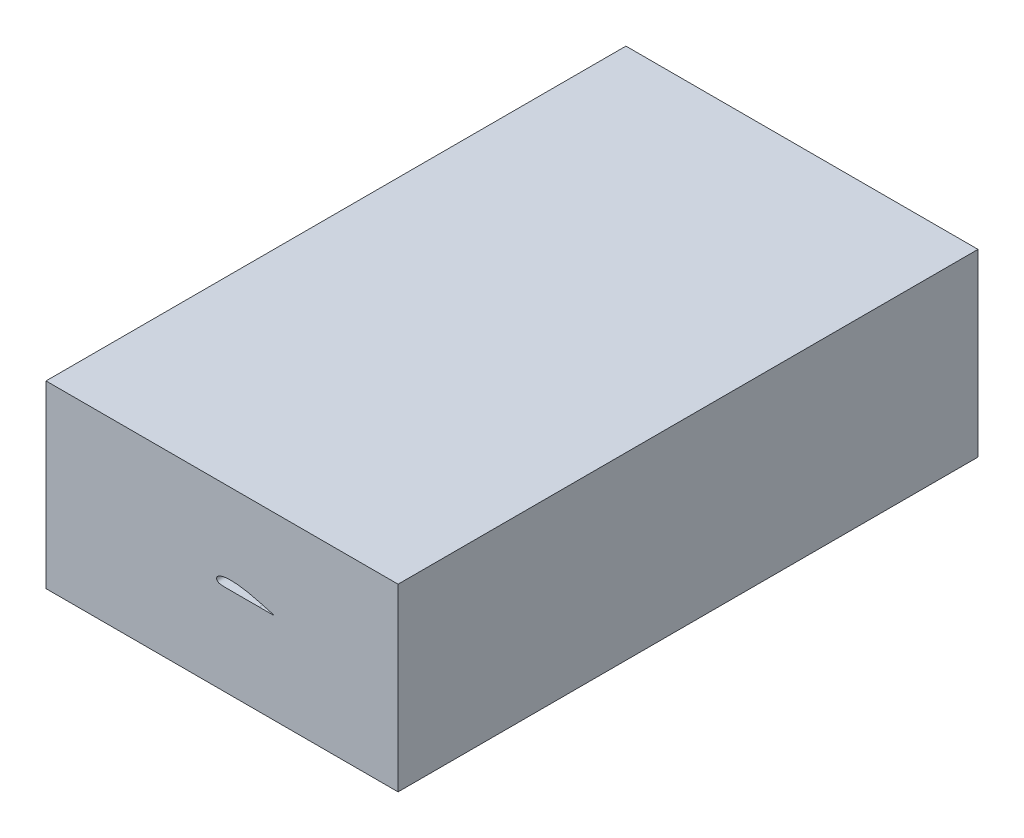
ISO-10303-21;
HEADER;
FILE_DESCRIPTION(('STEP AP214'),'2;1');
FILE_NAME('part.step','',(''),(''),'','','');
FILE_SCHEMA(('AUTOMOTIVE_DESIGN { 1 0 10303 214 1 1 1 1 }'));
ENDSEC;
DATA;
#1=APPLICATION_CONTEXT('core data for automotive mechanical design processes');
#2=APPLICATION_PROTOCOL_DEFINITION('international standard','automotive_design',2000,#1);
#3=PRODUCT_CONTEXT('',#1,'mechanical');
#4=PRODUCT('Part','Part','',(#3));
#5=PRODUCT_RELATED_PRODUCT_CATEGORY('part','',(#4));
#6=PRODUCT_DEFINITION_FORMATION('','',#4);
#7=PRODUCT_DEFINITION_CONTEXT('part definition',#1,'design');
#8=PRODUCT_DEFINITION('design','',#6,#7);
#9=PRODUCT_DEFINITION_SHAPE('','',#8);
#10=(LENGTH_UNIT() NAMED_UNIT(*) SI_UNIT(.MILLI.,.METRE.));
#11=(NAMED_UNIT(*) PLANE_ANGLE_UNIT() SI_UNIT($,.RADIAN.));
#12=(NAMED_UNIT(*) SI_UNIT($,.STERADIAN.) SOLID_ANGLE_UNIT());
#13=UNCERTAINTY_MEASURE_WITH_UNIT(LENGTH_MEASURE(1.E-05),#10,'distance_accuracy_value','');
#14=(GEOMETRIC_REPRESENTATION_CONTEXT(3) GLOBAL_UNCERTAINTY_ASSIGNED_CONTEXT((#13)) GLOBAL_UNIT_ASSIGNED_CONTEXT((#10,
#11,#12)) REPRESENTATION_CONTEXT('',''));
#15=CARTESIAN_POINT('',(0.,0.,0.));
#16=DIRECTION('',(0.,0.,1.));
#17=DIRECTION('',(1.,0.,0.));
#18=AXIS2_PLACEMENT_3D('',#15,#16,#17);
#19=CARTESIAN_POINT('',(0.,0.,1200.));
#20=DIRECTION('',(0.,0.,1.));
#21=DIRECTION('',(1.,0.,0.));
#22=AXIS2_PLACEMENT_3D('',#19,#20,#21);
#23=PLANE('',#22);
#24=DIRECTION('',(0.,-1.,0.));
#25=VECTOR('',#24,1.);
#26=CARTESIAN_POINT('',(0.,204.676260253226,1200.));
#27=LINE('',#26,#25);
#28=CARTESIAN_POINT('',(0.,204.676260253226,1200.));
#29=VERTEX_POINT('',#28);
#30=CARTESIAN_POINT('',(0.,-167.571352555479,1200.));
#31=VERTEX_POINT('',#30);
#32=EDGE_CURVE('E142',#29,#31,#27,.T.);
#33=ORIENTED_EDGE('',*,*,#32,.T.);
#34=DIRECTION('',(1.,0.,0.));
#35=VECTOR('',#34,1.);
#36=CARTESIAN_POINT('',(0.,-167.571352555479,1200.));
#37=LINE('',#36,#35);
#38=CARTESIAN_POINT('',(728.507712525835,-167.571352555479,1200.));
#39=VERTEX_POINT('',#38);
#40=EDGE_CURVE('E145',#31,#39,#37,.T.);
#41=ORIENTED_EDGE('',*,*,#40,.T.);
#42=DIRECTION('',(0.,1.,0.));
#43=VECTOR('',#42,1.);
#44=CARTESIAN_POINT('',(728.507712525835,204.676260253226,1200.));
#45=LINE('',#44,#43);
#46=CARTESIAN_POINT('',(728.507712525835,204.676260253226,1200.));
#47=VERTEX_POINT('',#46);
#48=EDGE_CURVE('E148',#39,#47,#45,.T.);
#49=ORIENTED_EDGE('',*,*,#48,.T.);
#50=DIRECTION('',(-1.,0.,0.));
#51=VECTOR('',#50,1.);
#52=CARTESIAN_POINT('',(0.,204.676260253226,1200.));
#53=LINE('',#52,#51);
#54=EDGE_CURVE('E150',#47,#29,#53,.T.);
#55=ORIENTED_EDGE('',*,*,#54,.T.);
#56=EDGE_LOOP('',(#33,#41,#49,#55));
#57=FACE_BOUND('',#56,.T.);
#58=DIRECTION('',(1.,0.,0.));
#59=VECTOR('',#58,1.);
#60=CARTESIAN_POINT('',(441.393772371793,20.1124523795362,1200.));
#61=LINE('',#60,#59);
#62=CARTESIAN_POINT('',(441.393772371793,20.1124523795362,1200.));
#63=VERTEX_POINT('',#62);
#64=CARTESIAN_POINT('',(470.720248748028,20.1124523795363,1200.));
#65=VERTEX_POINT('',#64);
#66=EDGE_CURVE('E106',#63,#65,#61,.T.);
#67=ORIENTED_EDGE('',*,*,#66,.F.);
#68=CARTESIAN_POINT('',(442.557049847993,28.8562779930486,1200.));
#69=CARTESIAN_POINT('',(439.072672672651,29.8120661893965,1200.));
#70=CARTESIAN_POINT('',(432.099912620264,31.6715962162049,1200.));
#71=CARTESIAN_POINT('',(421.486806005528,34.1105780280946,1200.));
#72=CARTESIAN_POINT('',(410.779849110611,36.1975398101461,1200.));
#73=CARTESIAN_POINT('',(401.720197274352,37.488657383955,1200.));
#74=CARTESIAN_POINT('',(394.41281853896,38.2045326701608,1200.));
#75=CARTESIAN_POINT('',(388.865337545691,38.5359098487311,1200.));
#76=CARTESIAN_POINT('',(383.377043684156,38.6453962158012,1200.));
#77=CARTESIAN_POINT('',(378.776739099679,38.6310045666827,1200.));
#78=CARTESIAN_POINT('',(374.963490259182,38.4319190984465,1200.));
#79=CARTESIAN_POINT('',(372.066182641251,38.140016341929,1200.));
#80=CARTESIAN_POINT('',(369.210683302152,37.7069672209041,1200.));
#81=CARTESIAN_POINT('',(366.827818433234,37.2314362615503,1200.));
#82=CARTESIAN_POINT('',(364.908429325882,36.7538958923076,1200.));
#83=CARTESIAN_POINT('',(363.479940401,36.3494856552582,1200.));
#84=CARTESIAN_POINT('',(362.056434922454,35.8957673309557,1200.));
#85=CARTESIAN_POINT('',(360.572839348893,35.35285722665,1200.));
#86=CARTESIAN_POINT('',(359.28769826388,34.7841452711708,1200.));
#87=CARTESIAN_POINT('',(358.216447641223,34.2146001399463,1200.));
#88=CARTESIAN_POINT('',(357.389050585476,33.7068980737799,1200.));
#89=CARTESIAN_POINT('',(356.552615658043,33.1030648747338,1200.));
#90=CARTESIAN_POINT('',(355.820762745851,32.4753357525396,1200.));
#91=CARTESIAN_POINT('',(355.354503462645,32.0442095034921,1200.));
#92=CARTESIAN_POINT('',(354.855699670665,31.5528495532229,1200.));
#93=CARTESIAN_POINT('',(354.389957132187,31.0255851572889,1200.));
#94=CARTESIAN_POINT('',(353.964999314076,30.4492034467225,1200.));
#95=CARTESIAN_POINT('',(353.586282932792,29.767186255399,1200.));
#96=CARTESIAN_POINT('',(353.227738954648,28.9329442974887,1200.));
#97=CARTESIAN_POINT('',(352.961298812208,27.6499416267636,1200.));
#98=CARTESIAN_POINT('',(353.111643283169,26.2983268889727,1200.));
#99=CARTESIAN_POINT('',(353.365330175192,25.4506232836227,1200.));
#100=CARTESIAN_POINT('',(353.695602528084,24.7528864611856,1200.));
#101=CARTESIAN_POINT('',(353.998210399166,24.262418144221,1200.));
#102=CARTESIAN_POINT('',(354.347839515911,23.7930228675255,1200.));
#103=CARTESIAN_POINT('',(354.788881725835,23.3017151067969,1200.));
#104=CARTESIAN_POINT('',(355.325142217004,22.8111128434673,1200.));
#105=CARTESIAN_POINT('',(356.055967315444,22.2868342790246,1200.));
#106=CARTESIAN_POINT('',(356.839748985731,21.8718358810368,1200.));
#107=CARTESIAN_POINT('',(357.765467063464,21.5068160558118,1200.));
#108=CARTESIAN_POINT('',(358.640116289018,21.2810109318307,1200.));
#109=CARTESIAN_POINT('',(359.28804598777,21.1302618440849,1200.));
#110=CARTESIAN_POINT('',(360.069783323769,20.9562480213636,1200.));
#111=CARTESIAN_POINT('',(360.904853145306,20.8055776986475,1200.));
#112=CARTESIAN_POINT('',(361.971898145868,20.6520119396105,1200.));
#113=CARTESIAN_POINT('',(363.214024727821,20.526416591067,1200.));
#114=CARTESIAN_POINT('',(364.578709921404,20.4100810965767,1200.));
#115=CARTESIAN_POINT('',(365.978183778209,20.3046202883556,1200.));
#116=CARTESIAN_POINT('',(367.378711377044,20.2199849675604,1200.));
#117=CARTESIAN_POINT('',(369.228950931682,20.131407075753,1200.));
#118=CARTESIAN_POINT('',(371.530679735066,20.0563600982902,1200.));
#119=CARTESIAN_POINT('',(374.271249485054,20.0109189711607,1200.));
#120=CARTESIAN_POINT('',(376.991001378152,19.9944477821466,1200.));
#121=CARTESIAN_POINT('',(379.696108674457,19.9963683471482,1200.));
#122=CARTESIAN_POINT('',(383.274859524469,20.0094440069358,1200.));
#123=CARTESIAN_POINT('',(387.73502139687,20.0176599108285,1200.));
#124=CARTESIAN_POINT('',(393.104461409822,20.0244259580925,1200.));
#125=CARTESIAN_POINT('',(398.470497743268,20.0350356377404,1200.));
#126=CARTESIAN_POINT('',(403.835453793735,20.0447632587505,1200.));
#127=CARTESIAN_POINT('',(410.989397891903,20.0580212802337,1200.));
#128=CARTESIAN_POINT('',(419.93147629828,20.0736388729501,1200.));
#129=CARTESIAN_POINT('',(430.662185951528,20.0932549024161,1200.));
#130=CARTESIAN_POINT('',(437.816630749247,20.1056430744243,1200.));
#131=CARTESIAN_POINT('',(441.393772371793,20.1124523795362,1200.));
#132=B_SPLINE_CURVE_WITH_KNOTS('',3,(#68,#69,#70,#71,#72,#73,#74,#75,#76,#77,#78,#79,#80,#81,
#82,#83,#84,#85,#86,#87,#88,#89,#90,#91,#92,#93,#94,#95,#96,#97,#98,#99,#100,#101,#102,#103,
#104,#105,#106,#107,#108,#109,#110,#111,#112,#113,#114,#115,#116,#117,#118,#119,#120,#121,#122,
#123,#124,#125,#126,#127,#128,#129,#130,#131),.UNSPECIFIED.,.F.,.F.,(4,1,1,1,1,1,1,1,1,1,1,1,1,
1,1,1,1,1,1,1,1,1,1,1,1,1,1,1,1,1,1,1,1,1,1,1,1,1,1,1,1,1,1,1,1,1,1,1,1,1,1,1,1,1,1,1,1,1,1,1,1,
4),(0.,0.0624984756248744,0.124996951249749,0.187495426874623,0.249993902499497,
0.281243140311935,0.312492378124372,0.343741615936809,0.374990853749246,0.390615472655465,
0.406240091561684,0.421864710467902,0.437489329374121,0.44530163882723,0.453113948280339,
0.460926257733449,0.468738567186558,0.476550876639667,0.480457031366222,0.484363186092776,
0.488269340819331,0.492175495545886,0.49608165027244,0.498034727635718,0.499987804998995,
0.501940882362272,0.502917421043911,0.50389395972555,0.505847037088827,0.506823575770466,
0.507800114452104,0.508776653133743,0.509753191815382,0.51072973049702,0.511706269178659,
0.513659346541936,0.515612423905214,0.517565501268491,0.519518578631768,0.523424733358323,
0.527330888084878,0.531237042811432,0.535143197537987,0.539049352264542,0.546861661717651,
0.55467397117076,0.562486280623869,0.570298590076979,0.578110899530088,0.593735518436307,
0.609360137342525,0.624984756248744,0.640609375154962,0.656233994061181,0.687483231873618,
0.718732469686055,0.749981707498493,0.78123094531093,0.812480183123367,0.874978658748241,
0.937477134373116,0.99997560999799),.UNSPECIFIED.);
#133=CARTESIAN_POINT('',(442.557049847993,28.8562779930486,1200.));
#134=VERTEX_POINT('',#133);
#135=EDGE_CURVE('E98',#134,#63,#132,.T.);
#136=ORIENTED_EDGE('',*,*,#135,.F.);
#137=DIRECTION('',(-0.964376117229069,0.264534883367364,0.));
#138=VECTOR('',#137,1.);
#139=CARTESIAN_POINT('',(470.852516189712,21.0946404381508,1200.));
#140=LINE('',#139,#138);
#141=CARTESIAN_POINT('',(470.852516189712,21.0946404381508,1200.));
#142=VERTEX_POINT('',#141);
#143=EDGE_CURVE('E120',#142,#134,#140,.T.);
#144=ORIENTED_EDGE('',*,*,#143,.F.);
#145=CARTESIAN_POINT('',(470.720248748028,20.6124523795363,1200.));
#146=DIRECTION('',(0.,0.,1.));
#147=DIRECTION('',(1.,0.,0.));
#148=AXIS2_PLACEMENT_3D('',#145,#146,#147);
#149=CIRCLE('',#148,0.500000000000002);
#150=EDGE_CURVE('E118',#65,#142,#149,.T.);
#151=ORIENTED_EDGE('',*,*,#150,.F.);
#152=EDGE_LOOP('',(#67,#136,#144,#151));
#153=FACE_BOUND('',#152,.T.);
#154=ADVANCED_FACE('F33',(#57,#153),#23,.T.);
#155=CARTESIAN_POINT('',(0.,0.,0.));
#156=DIRECTION('',(0.,0.,1.));
#157=DIRECTION('',(1.,0.,0.));
#158=AXIS2_PLACEMENT_3D('',#155,#156,#157);
#159=PLANE('',#158);
#160=DIRECTION('',(0.,-1.,0.));
#161=VECTOR('',#160,1.);
#162=CARTESIAN_POINT('',(0.,204.676260253226,0.));
#163=LINE('',#162,#161);
#164=CARTESIAN_POINT('',(0.,204.676260253226,0.));
#165=VERTEX_POINT('',#164);
#166=CARTESIAN_POINT('',(0.,-167.571352555479,0.));
#167=VERTEX_POINT('',#166);
#168=EDGE_CURVE('E114',#165,#167,#163,.T.);
#169=ORIENTED_EDGE('',*,*,#168,.F.);
#170=DIRECTION('',(-1.,0.,0.));
#171=VECTOR('',#170,1.);
#172=CARTESIAN_POINT('',(0.,204.676260253226,0.));
#173=LINE('',#172,#171);
#174=CARTESIAN_POINT('',(728.507712525835,204.676260253226,0.));
#175=VERTEX_POINT('',#174);
#176=EDGE_CURVE('E146',#175,#165,#173,.T.);
#177=ORIENTED_EDGE('',*,*,#176,.F.);
#178=DIRECTION('',(0.,1.,0.));
#179=VECTOR('',#178,1.);
#180=CARTESIAN_POINT('',(728.507712525835,204.676260253226,0.));
#181=LINE('',#180,#179);
#182=CARTESIAN_POINT('',(728.507712525835,-167.571352555479,0.));
#183=VERTEX_POINT('',#182);
#184=EDGE_CURVE('E157',#183,#175,#181,.T.);
#185=ORIENTED_EDGE('',*,*,#184,.F.);
#186=DIRECTION('',(1.,0.,0.));
#187=VECTOR('',#186,1.);
#188=CARTESIAN_POINT('',(0.,-167.571352555479,0.));
#189=LINE('',#188,#187);
#190=EDGE_CURVE('E155',#167,#183,#189,.T.);
#191=ORIENTED_EDGE('',*,*,#190,.F.);
#192=EDGE_LOOP('',(#169,#177,#185,#191));
#193=FACE_BOUND('',#192,.T.);
#194=CARTESIAN_POINT('',(442.557049847993,28.8562779930486,0.));
#195=CARTESIAN_POINT('',(439.072672672651,29.8120661893965,0.));
#196=CARTESIAN_POINT('',(432.099912620264,31.6715962162049,0.));
#197=CARTESIAN_POINT('',(421.486806005528,34.1105780280946,0.));
#198=CARTESIAN_POINT('',(410.779849110611,36.1975398101461,0.));
#199=CARTESIAN_POINT('',(401.720197274352,37.488657383955,0.));
#200=CARTESIAN_POINT('',(394.41281853896,38.2045326701608,0.));
#201=CARTESIAN_POINT('',(388.865337545691,38.5359098487311,0.));
#202=CARTESIAN_POINT('',(383.377043684156,38.6453962158012,0.));
#203=CARTESIAN_POINT('',(378.776739099679,38.6310045666827,0.));
#204=CARTESIAN_POINT('',(374.963490259182,38.4319190984465,0.));
#205=CARTESIAN_POINT('',(372.066182641251,38.140016341929,0.));
#206=CARTESIAN_POINT('',(369.210683302152,37.7069672209041,0.));
#207=CARTESIAN_POINT('',(366.827818433234,37.2314362615503,0.));
#208=CARTESIAN_POINT('',(364.908429325882,36.7538958923076,0.));
#209=CARTESIAN_POINT('',(363.479940401,36.3494856552582,0.));
#210=CARTESIAN_POINT('',(362.056434922454,35.8957673309557,0.));
#211=CARTESIAN_POINT('',(360.572839348893,35.35285722665,0.));
#212=CARTESIAN_POINT('',(359.28769826388,34.7841452711708,0.));
#213=CARTESIAN_POINT('',(358.216447641223,34.2146001399463,0.));
#214=CARTESIAN_POINT('',(357.389050585476,33.7068980737799,0.));
#215=CARTESIAN_POINT('',(356.552615658043,33.1030648747338,0.));
#216=CARTESIAN_POINT('',(355.820762745851,32.4753357525396,0.));
#217=CARTESIAN_POINT('',(355.354503462645,32.0442095034921,0.));
#218=CARTESIAN_POINT('',(354.855699670665,31.5528495532229,0.));
#219=CARTESIAN_POINT('',(354.389957132187,31.0255851572889,0.));
#220=CARTESIAN_POINT('',(353.964999314076,30.4492034467225,0.));
#221=CARTESIAN_POINT('',(353.586282932792,29.767186255399,0.));
#222=CARTESIAN_POINT('',(353.227738954648,28.9329442974887,0.));
#223=CARTESIAN_POINT('',(352.961298812208,27.6499416267636,0.));
#224=CARTESIAN_POINT('',(353.111643283169,26.2983268889727,0.));
#225=CARTESIAN_POINT('',(353.365330175192,25.4506232836227,0.));
#226=CARTESIAN_POINT('',(353.695602528084,24.7528864611856,0.));
#227=CARTESIAN_POINT('',(353.998210399166,24.262418144221,0.));
#228=CARTESIAN_POINT('',(354.347839515911,23.7930228675255,0.));
#229=CARTESIAN_POINT('',(354.788881725835,23.3017151067969,0.));
#230=CARTESIAN_POINT('',(355.325142217004,22.8111128434673,0.));
#231=CARTESIAN_POINT('',(356.055967315444,22.2868342790246,0.));
#232=CARTESIAN_POINT('',(356.839748985731,21.8718358810368,0.));
#233=CARTESIAN_POINT('',(357.765467063464,21.5068160558118,0.));
#234=CARTESIAN_POINT('',(358.640116289018,21.2810109318307,0.));
#235=CARTESIAN_POINT('',(359.28804598777,21.1302618440849,0.));
#236=CARTESIAN_POINT('',(360.069783323769,20.9562480213636,0.));
#237=CARTESIAN_POINT('',(360.904853145306,20.8055776986475,0.));
#238=CARTESIAN_POINT('',(361.971898145868,20.6520119396105,0.));
#239=CARTESIAN_POINT('',(363.214024727821,20.526416591067,0.));
#240=CARTESIAN_POINT('',(364.578709921404,20.4100810965767,0.));
#241=CARTESIAN_POINT('',(365.978183778209,20.3046202883556,0.));
#242=CARTESIAN_POINT('',(367.378711377044,20.2199849675604,0.));
#243=CARTESIAN_POINT('',(369.228950931682,20.131407075753,0.));
#244=CARTESIAN_POINT('',(371.530679735066,20.0563600982902,0.));
#245=CARTESIAN_POINT('',(374.271249485054,20.0109189711607,0.));
#246=CARTESIAN_POINT('',(376.991001378152,19.9944477821466,0.));
#247=CARTESIAN_POINT('',(379.696108674457,19.9963683471482,0.));
#248=CARTESIAN_POINT('',(383.274859524469,20.0094440069358,0.));
#249=CARTESIAN_POINT('',(387.73502139687,20.0176599108285,0.));
#250=CARTESIAN_POINT('',(393.104461409822,20.0244259580925,0.));
#251=CARTESIAN_POINT('',(398.470497743268,20.0350356377404,0.));
#252=CARTESIAN_POINT('',(403.835453793735,20.0447632587505,0.));
#253=CARTESIAN_POINT('',(410.989397891903,20.0580212802337,0.));
#254=CARTESIAN_POINT('',(419.93147629828,20.0736388729501,0.));
#255=CARTESIAN_POINT('',(430.662185951528,20.0932549024161,0.));
#256=CARTESIAN_POINT('',(437.816630749247,20.1056430744243,0.));
#257=CARTESIAN_POINT('',(441.393772371793,20.1124523795362,0.));
#258=B_SPLINE_CURVE_WITH_KNOTS('',3,(#194,#195,#196,#197,#198,#199,#200,#201,#202,#203,#204,
#205,#206,#207,#208,#209,#210,#211,#212,#213,#214,#215,#216,#217,#218,#219,#220,#221,#222,#223,
#224,#225,#226,#227,#228,#229,#230,#231,#232,#233,#234,#235,#236,#237,#238,#239,#240,#241,#242,
#243,#244,#245,#246,#247,#248,#249,#250,#251,#252,#253,#254,#255,#256,#257),.UNSPECIFIED.,.F.,
.F.,(4,1,1,1,1,1,1,1,1,1,1,1,1,1,1,1,1,1,1,1,1,1,1,1,1,1,1,1,1,1,1,1,1,1,1,1,1,1,1,1,1,1,1,1,1,
1,1,1,1,1,1,1,1,1,1,1,1,1,1,1,1,4),(0.,0.0624984756248744,0.124996951249749,0.187495426874623,
0.249993902499497,0.281243140311935,0.312492378124372,0.343741615936809,0.374990853749246,
0.390615472655465,0.406240091561684,0.421864710467902,0.437489329374121,0.44530163882723,
0.453113948280339,0.460926257733449,0.468738567186558,0.476550876639667,0.480457031366222,
0.484363186092776,0.488269340819331,0.492175495545886,0.49608165027244,0.498034727635718,
0.499987804998995,0.501940882362272,0.502917421043911,0.50389395972555,0.505847037088827,
0.506823575770466,0.507800114452104,0.508776653133743,0.509753191815382,0.51072973049702,
0.511706269178659,0.513659346541936,0.515612423905214,0.517565501268491,0.519518578631768,
0.523424733358323,0.527330888084878,0.531237042811432,0.535143197537987,0.539049352264542,
0.546861661717651,0.55467397117076,0.562486280623869,0.570298590076979,0.578110899530088,
0.593735518436307,0.609360137342525,0.624984756248744,0.640609375154962,0.656233994061181,
0.687483231873618,0.718732469686055,0.749981707498493,0.78123094531093,0.812480183123367,
0.874978658748241,0.937477134373116,0.99997560999799),.UNSPECIFIED.);
#259=CARTESIAN_POINT('',(442.557049847994,28.8562779930486,0.));
#260=VERTEX_POINT('',#259);
#261=CARTESIAN_POINT('',(441.393772371793,20.1124523795362,0.));
#262=VERTEX_POINT('',#261);
#263=EDGE_CURVE('E56',#260,#262,#258,.T.);
#264=ORIENTED_EDGE('',*,*,#263,.T.);
#265=DIRECTION('',(1.,0.,0.));
#266=VECTOR('',#265,1.);
#267=CARTESIAN_POINT('',(441.393772371793,20.1124523795362,0.));
#268=LINE('',#267,#266);
#269=CARTESIAN_POINT('',(470.720248748028,20.1124523795363,0.));
#270=VERTEX_POINT('',#269);
#271=EDGE_CURVE('E113',#262,#270,#268,.T.);
#272=ORIENTED_EDGE('',*,*,#271,.T.);
#273=CARTESIAN_POINT('',(470.720248748028,20.6124523795363,0.));
#274=DIRECTION('',(0.,0.,1.));
#275=DIRECTION('',(1.,0.,0.));
#276=AXIS2_PLACEMENT_3D('',#273,#274,#275);
#277=CIRCLE('',#276,0.500000000000002);
#278=CARTESIAN_POINT('',(470.852516189712,21.0946404381508,0.));
#279=VERTEX_POINT('',#278);
#280=EDGE_CURVE('E134',#270,#279,#277,.T.);
#281=ORIENTED_EDGE('',*,*,#280,.T.);
#282=DIRECTION('',(-0.964376117229069,0.264534883367364,0.));
#283=VECTOR('',#282,1.);
#284=CARTESIAN_POINT('',(470.852516189712,21.0946404381508,0.));
#285=LINE('',#284,#283);
#286=EDGE_CURVE('E107',#279,#260,#285,.T.);
#287=ORIENTED_EDGE('',*,*,#286,.T.);
#288=EDGE_LOOP('',(#264,#272,#281,#287));
#289=FACE_BOUND('',#288,.T.);
#290=ADVANCED_FACE('F175',(#193,#289),#159,.F.);
#291=CARTESIAN_POINT('',(0.,204.676260253226,1200.));
#292=DIRECTION('',(1.,0.,0.));
#293=DIRECTION('',(0.,0.,-1.));
#294=AXIS2_PLACEMENT_3D('',#291,#292,#293);
#295=PLANE('',#294);
#296=ORIENTED_EDGE('',*,*,#168,.T.);
#297=DIRECTION('',(0.,0.,-1.));
#298=VECTOR('',#297,1.);
#299=CARTESIAN_POINT('',(0.,-167.571352555479,1200.));
#300=LINE('',#299,#298);
#301=EDGE_CURVE('E11',#31,#167,#300,.T.);
#302=ORIENTED_EDGE('',*,*,#301,.F.);
#303=ORIENTED_EDGE('',*,*,#32,.F.);
#304=DIRECTION('',(0.,0.,-1.));
#305=VECTOR('',#304,1.);
#306=CARTESIAN_POINT('',(0.,204.676260253226,1200.));
#307=LINE('',#306,#305);
#308=EDGE_CURVE('E152',#29,#165,#307,.T.);
#309=ORIENTED_EDGE('',*,*,#308,.T.);
#310=EDGE_LOOP('',(#296,#302,#303,#309));
#311=FACE_BOUND('',#310,.T.);
#312=ADVANCED_FACE('F35',(#311),#295,.F.);
#313=CARTESIAN_POINT('',(0.,-167.571352555479,1200.));
#314=DIRECTION('',(0.,1.,0.));
#315=DIRECTION('',(0.,0.,1.));
#316=AXIS2_PLACEMENT_3D('',#313,#314,#315);
#317=PLANE('',#316);
#318=ORIENTED_EDGE('',*,*,#190,.T.);
#319=DIRECTION('',(0.,0.,-1.));
#320=VECTOR('',#319,1.);
#321=CARTESIAN_POINT('',(728.507712525835,-167.571352555479,1200.));
#322=LINE('',#321,#320);
#323=EDGE_CURVE('E41',#39,#183,#322,.T.);
#324=ORIENTED_EDGE('',*,*,#323,.F.);
#325=ORIENTED_EDGE('',*,*,#40,.F.);
#326=ORIENTED_EDGE('',*,*,#301,.T.);
#327=EDGE_LOOP('',(#318,#324,#325,#326));
#328=FACE_BOUND('',#327,.T.);
#329=ADVANCED_FACE('F185',(#328),#317,.F.);
#330=CARTESIAN_POINT('',(728.507712525835,204.676260253226,1200.));
#331=DIRECTION('',(-1.,0.,0.));
#332=DIRECTION('',(0.,0.,1.));
#333=AXIS2_PLACEMENT_3D('',#330,#331,#332);
#334=PLANE('',#333);
#335=ORIENTED_EDGE('',*,*,#184,.T.);
#336=DIRECTION('',(0.,0.,-1.));
#337=VECTOR('',#336,1.);
#338=CARTESIAN_POINT('',(728.507712525835,204.676260253226,1200.));
#339=LINE('',#338,#337);
#340=EDGE_CURVE('E162',#47,#175,#339,.T.);
#341=ORIENTED_EDGE('',*,*,#340,.F.);
#342=ORIENTED_EDGE('',*,*,#48,.F.);
#343=ORIENTED_EDGE('',*,*,#323,.T.);
#344=EDGE_LOOP('',(#335,#341,#342,#343));
#345=FACE_BOUND('',#344,.T.);
#346=ADVANCED_FACE('F169',(#345),#334,.F.);
#347=CARTESIAN_POINT('',(0.,204.676260253226,1200.));
#348=DIRECTION('',(0.,-1.,0.));
#349=DIRECTION('',(0.,0.,-1.));
#350=AXIS2_PLACEMENT_3D('',#347,#348,#349);
#351=PLANE('',#350);
#352=ORIENTED_EDGE('',*,*,#176,.T.);
#353=ORIENTED_EDGE('',*,*,#308,.F.);
#354=ORIENTED_EDGE('',*,*,#54,.F.);
#355=ORIENTED_EDGE('',*,*,#340,.T.);
#356=EDGE_LOOP('',(#352,#353,#354,#355));
#357=FACE_BOUND('',#356,.T.);
#358=ADVANCED_FACE('F179',(#357),#351,.F.);
#359=DIRECTION('',(0.,0.,-1.));
#360=VECTOR('',#359,1.);
#361=SURFACE_OF_LINEAR_EXTRUSION('',#132,#360);
#362=ORIENTED_EDGE('',*,*,#263,.F.);
#363=DIRECTION('',(0.,0.,-1.));
#364=VECTOR('',#363,1.);
#365=CARTESIAN_POINT('',(442.557049847993,28.8562779930486,1200.));
#366=LINE('',#365,#364);
#367=EDGE_CURVE('E102',#134,#260,#366,.T.);
#368=ORIENTED_EDGE('',*,*,#367,.F.);
#369=ORIENTED_EDGE('',*,*,#135,.T.);
#370=DIRECTION('',(0.,0.,-1.));
#371=VECTOR('',#370,1.);
#372=CARTESIAN_POINT('',(441.393772371793,20.1124523795362,1200.));
#373=LINE('',#372,#371);
#374=EDGE_CURVE('E101',#63,#262,#373,.T.);
#375=ORIENTED_EDGE('',*,*,#374,.T.);
#376=EDGE_LOOP('',(#362,#368,#369,#375));
#377=FACE_BOUND('',#376,.T.);
#378=ADVANCED_FACE('F100',(#377),#361,.T.);
#379=CARTESIAN_POINT('',(441.393772371793,20.1124523795362,1200.));
#380=DIRECTION('',(0.,1.,0.));
#381=DIRECTION('',(-1.,0.,0.));
#382=AXIS2_PLACEMENT_3D('',#379,#380,#381);
#383=PLANE('',#382);
#384=ORIENTED_EDGE('',*,*,#271,.F.);
#385=ORIENTED_EDGE('',*,*,#374,.F.);
#386=ORIENTED_EDGE('',*,*,#66,.T.);
#387=DIRECTION('',(0.,0.,-1.));
#388=VECTOR('',#387,1.);
#389=CARTESIAN_POINT('',(470.720248748028,20.1124523795363,1200.));
#390=LINE('',#389,#388);
#391=EDGE_CURVE('E115',#65,#270,#390,.T.);
#392=ORIENTED_EDGE('',*,*,#391,.T.);
#393=EDGE_LOOP('',(#384,#385,#386,#392));
#394=FACE_BOUND('',#393,.T.);
#395=ADVANCED_FACE('F110',(#394),#383,.T.);
#396=CARTESIAN_POINT('',(470.720248748028,20.6124523795363,1200.));
#397=DIRECTION('',(0.,0.,-1.));
#398=DIRECTION('',(-1.,0.,0.));
#399=AXIS2_PLACEMENT_3D('',#396,#397,#398);
#400=CYLINDRICAL_SURFACE('',#399,0.500000000000002);
#401=ORIENTED_EDGE('',*,*,#280,.F.);
#402=ORIENTED_EDGE('',*,*,#391,.F.);
#403=ORIENTED_EDGE('',*,*,#150,.T.);
#404=DIRECTION('',(0.,0.,-1.));
#405=VECTOR('',#404,1.);
#406=CARTESIAN_POINT('',(470.852516189712,21.0946404381508,1200.));
#407=LINE('',#406,#405);
#408=EDGE_CURVE('E48',#142,#279,#407,.T.);
#409=ORIENTED_EDGE('',*,*,#408,.T.);
#410=EDGE_LOOP('',(#401,#402,#403,#409));
#411=FACE_BOUND('',#410,.T.);
#412=ADVANCED_FACE('F208',(#411),#400,.F.);
#413=CARTESIAN_POINT('',(470.852516189712,21.0946404381508,1200.));
#414=DIRECTION('',(-0.264534883367364,-0.964376117229069,0.));
#415=DIRECTION('',(0.964376117229069,-0.264534883367364,0.));
#416=AXIS2_PLACEMENT_3D('',#413,#414,#415);
#417=PLANE('',#416);
#418=ORIENTED_EDGE('',*,*,#286,.F.);
#419=ORIENTED_EDGE('',*,*,#408,.F.);
#420=ORIENTED_EDGE('',*,*,#143,.T.);
#421=ORIENTED_EDGE('',*,*,#367,.T.);
#422=EDGE_LOOP('',(#418,#419,#420,#421));
#423=FACE_BOUND('',#422,.T.);
#424=ADVANCED_FACE('F212',(#423),#417,.T.);
#425=CLOSED_SHELL('',(#154,#290,#312,#329,#346,#358,#378,#395,#412,#424));
#426=MANIFOLD_SOLID_BREP('B2',#425);
#427=ADVANCED_BREP_SHAPE_REPRESENTATION('',(#18,#426),#14);
#428=SHAPE_DEFINITION_REPRESENTATION(#9,#427);
ENDSEC;
END-ISO-10303-21;
